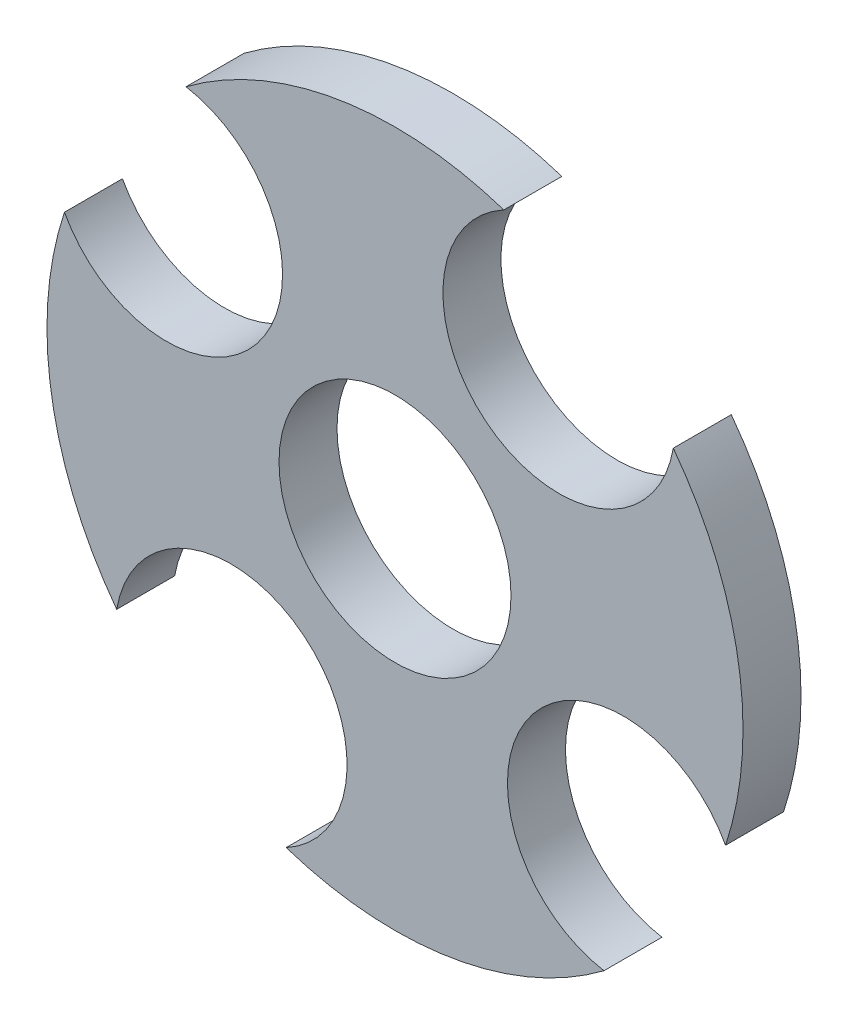
ISO-10303-21;
HEADER;
FILE_DESCRIPTION(('STEP AP214'),'2;1');
FILE_NAME('part.step','',(''),(''),'','','');
FILE_SCHEMA(('AUTOMOTIVE_DESIGN { 1 0 10303 214 1 1 1 1 }'));
ENDSEC;
DATA;
#1=APPLICATION_CONTEXT('core data for automotive mechanical design processes');
#2=APPLICATION_PROTOCOL_DEFINITION('international standard','automotive_design',2000,#1);
#3=PRODUCT_CONTEXT('',#1,'mechanical');
#4=PRODUCT('Part','Part','',(#3));
#5=PRODUCT_RELATED_PRODUCT_CATEGORY('part','',(#4));
#6=PRODUCT_DEFINITION_FORMATION('','',#4);
#7=PRODUCT_DEFINITION_CONTEXT('part definition',#1,'design');
#8=PRODUCT_DEFINITION('design','',#6,#7);
#9=PRODUCT_DEFINITION_SHAPE('','',#8);
#10=(LENGTH_UNIT() NAMED_UNIT(*) SI_UNIT(.MILLI.,.METRE.));
#11=(NAMED_UNIT(*) PLANE_ANGLE_UNIT() SI_UNIT($,.RADIAN.));
#12=(NAMED_UNIT(*) SI_UNIT($,.STERADIAN.) SOLID_ANGLE_UNIT());
#13=UNCERTAINTY_MEASURE_WITH_UNIT(LENGTH_MEASURE(1.E-05),#10,'distance_accuracy_value','');
#14=(GEOMETRIC_REPRESENTATION_CONTEXT(3) GLOBAL_UNCERTAINTY_ASSIGNED_CONTEXT((#13)) GLOBAL_UNIT_ASSIGNED_CONTEXT((#10,
#11,#12)) REPRESENTATION_CONTEXT('',''));
#15=CARTESIAN_POINT('',(0.,0.,0.));
#16=DIRECTION('',(0.,0.,1.));
#17=DIRECTION('',(1.,0.,0.));
#18=AXIS2_PLACEMENT_3D('',#15,#16,#17);
#19=CARTESIAN_POINT('',(-4.48700280832463,-6.25295349859596,3.175));
#20=DIRECTION('',(0.,0.,1.));
#21=DIRECTION('',(1.,0.,0.));
#22=AXIS2_PLACEMENT_3D('',#19,#20,#21);
#23=PLANE('',#22);
#24=CARTESIAN_POINT('',(-8.97400561664927,-12.5059069971919,3.175));
#25=DIRECTION('',(0.,0.,-1.));
#26=DIRECTION('',(1.,0.,0.));
#27=AXIS2_PLACEMENT_3D('',#24,#25,#26);
#28=CIRCLE('',#27,6.35);
#29=CARTESIAN_POINT('',(-15.2336443291926,-11.4384693229321,3.175));
#30=VERTEX_POINT('',#29);
#31=CARTESIAN_POINT('',(-5.95843745398481,-18.0941847870235,3.175));
#32=VERTEX_POINT('',#31);
#33=EDGE_CURVE('E164',#30,#32,#28,.T.);
#34=ORIENTED_EDGE('',*,*,#33,.T.);
#35=CARTESIAN_POINT('',(0.,0.,3.175));
#36=DIRECTION('',(0.,0.,1.));
#37=DIRECTION('',(1.,0.,0.));
#38=AXIS2_PLACEMENT_3D('',#35,#36,#37);
#39=CIRCLE('',#38,19.05);
#40=CARTESIAN_POINT('',(11.4384693229322,-15.2336443291925,3.175));
#41=VERTEX_POINT('',#40);
#42=EDGE_CURVE('E100',#32,#41,#39,.T.);
#43=ORIENTED_EDGE('',*,*,#42,.T.);
#44=CARTESIAN_POINT('',(12.505906997192,-8.97400561664923,3.175));
#45=DIRECTION('',(0.,0.,-1.));
#46=DIRECTION('',(1.,0.,0.));
#47=AXIS2_PLACEMENT_3D('',#44,#45,#46);
#48=CIRCLE('',#47,6.35);
#49=CARTESIAN_POINT('',(18.0941847870235,-5.95843745398474,3.175));
#50=VERTEX_POINT('',#49);
#51=EDGE_CURVE('E185',#41,#50,#48,.T.);
#52=ORIENTED_EDGE('',*,*,#51,.T.);
#53=CARTESIAN_POINT('',(0.,0.,3.175));
#54=DIRECTION('',(0.,0.,1.));
#55=DIRECTION('',(1.,0.,0.));
#56=AXIS2_PLACEMENT_3D('',#53,#54,#55);
#57=CIRCLE('',#56,19.05);
#58=CARTESIAN_POINT('',(15.2336443291926,11.4384693229321,3.175));
#59=VERTEX_POINT('',#58);
#60=EDGE_CURVE('E199',#50,#59,#57,.T.);
#61=ORIENTED_EDGE('',*,*,#60,.T.);
#62=CARTESIAN_POINT('',(8.97400561664927,12.5059069971919,3.175));
#63=DIRECTION('',(0.,0.,-1.));
#64=DIRECTION('',(1.,0.,0.));
#65=AXIS2_PLACEMENT_3D('',#62,#63,#64);
#66=CIRCLE('',#65,6.35);
#67=CARTESIAN_POINT('',(5.9584374539848,18.0941847870235,3.175));
#68=VERTEX_POINT('',#67);
#69=EDGE_CURVE('E119',#59,#68,#66,.T.);
#70=ORIENTED_EDGE('',*,*,#69,.T.);
#71=CARTESIAN_POINT('',(0.,0.,3.175));
#72=DIRECTION('',(0.,0.,1.));
#73=DIRECTION('',(1.,0.,0.));
#74=AXIS2_PLACEMENT_3D('',#71,#72,#73);
#75=CIRCLE('',#74,19.05);
#76=CARTESIAN_POINT('',(-11.4384693229322,15.2336443291925,3.175));
#77=VERTEX_POINT('',#76);
#78=EDGE_CURVE('E113',#68,#77,#75,.T.);
#79=ORIENTED_EDGE('',*,*,#78,.T.);
#80=CARTESIAN_POINT('',(-12.505906997192,8.97400561664922,3.175));
#81=DIRECTION('',(0.,0.,-1.));
#82=DIRECTION('',(1.,0.,0.));
#83=AXIS2_PLACEMENT_3D('',#80,#81,#82);
#84=CIRCLE('',#83,6.35);
#85=CARTESIAN_POINT('',(-18.0941847870235,5.95843745398473,3.175));
#86=VERTEX_POINT('',#85);
#87=EDGE_CURVE('E117',#77,#86,#84,.T.);
#88=ORIENTED_EDGE('',*,*,#87,.T.);
#89=CARTESIAN_POINT('',(0.,0.,3.175));
#90=DIRECTION('',(0.,0.,1.));
#91=DIRECTION('',(1.,0.,0.));
#92=AXIS2_PLACEMENT_3D('',#89,#90,#91);
#93=CIRCLE('',#92,19.05);
#94=EDGE_CURVE('E57',#86,#30,#93,.T.);
#95=ORIENTED_EDGE('',*,*,#94,.T.);
#96=EDGE_LOOP('',(#34,#43,#52,#61,#70,#79,#88,#95));
#97=FACE_BOUND('',#96,.T.);
#98=CARTESIAN_POINT('',(0.,0.,3.175));
#99=DIRECTION('',(0.,0.,1.));
#100=DIRECTION('',(1.,0.,0.));
#101=AXIS2_PLACEMENT_3D('',#98,#99,#100);
#102=CIRCLE('',#101,6.35);
#103=CARTESIAN_POINT('',(6.35,0.,3.175));
#104=VERTEX_POINT('',#103);
#105=EDGE_CURVE('E146',#104,#104,#102,.T.);
#106=ORIENTED_EDGE('',*,*,#105,.F.);
#107=EDGE_LOOP('',(#106));
#108=FACE_BOUND('',#107,.T.);
#109=ADVANCED_FACE('F39',(#97,#108),#23,.T.);
#110=CARTESIAN_POINT('',(-4.48700280832463,-6.25295349859596,0.));
#111=DIRECTION('',(0.,0.,1.));
#112=DIRECTION('',(1.,0.,0.));
#113=AXIS2_PLACEMENT_3D('',#110,#111,#112);
#114=PLANE('',#113);
#115=CARTESIAN_POINT('',(-8.97400561664927,-12.5059069971919,0.));
#116=DIRECTION('',(0.,0.,-1.));
#117=DIRECTION('',(1.,0.,0.));
#118=AXIS2_PLACEMENT_3D('',#115,#116,#117);
#119=CIRCLE('',#118,6.35);
#120=CARTESIAN_POINT('',(-15.2336443291926,-11.4384693229321,0.));
#121=VERTEX_POINT('',#120);
#122=CARTESIAN_POINT('',(-5.95843745398481,-18.0941847870235,0.));
#123=VERTEX_POINT('',#122);
#124=EDGE_CURVE('E141',#121,#123,#119,.T.);
#125=ORIENTED_EDGE('',*,*,#124,.F.);
#126=CARTESIAN_POINT('',(0.,0.,0.));
#127=DIRECTION('',(0.,0.,1.));
#128=DIRECTION('',(1.,0.,0.));
#129=AXIS2_PLACEMENT_3D('',#126,#127,#128);
#130=CIRCLE('',#129,19.05);
#131=CARTESIAN_POINT('',(-18.0941847870235,5.95843745398473,0.));
#132=VERTEX_POINT('',#131);
#133=EDGE_CURVE('E92',#132,#121,#130,.T.);
#134=ORIENTED_EDGE('',*,*,#133,.F.);
#135=CARTESIAN_POINT('',(-12.505906997192,8.97400561664922,0.));
#136=DIRECTION('',(0.,0.,-1.));
#137=DIRECTION('',(1.,0.,0.));
#138=AXIS2_PLACEMENT_3D('',#135,#136,#137);
#139=CIRCLE('',#138,6.35);
#140=CARTESIAN_POINT('',(-11.4384693229322,15.2336443291925,0.));
#141=VERTEX_POINT('',#140);
#142=EDGE_CURVE('E86',#141,#132,#139,.T.);
#143=ORIENTED_EDGE('',*,*,#142,.F.);
#144=CARTESIAN_POINT('',(0.,0.,0.));
#145=DIRECTION('',(0.,0.,1.));
#146=DIRECTION('',(1.,0.,0.));
#147=AXIS2_PLACEMENT_3D('',#144,#145,#146);
#148=CIRCLE('',#147,19.05);
#149=CARTESIAN_POINT('',(5.9584374539848,18.0941847870235,0.));
#150=VERTEX_POINT('',#149);
#151=EDGE_CURVE('E128',#150,#141,#148,.T.);
#152=ORIENTED_EDGE('',*,*,#151,.F.);
#153=CARTESIAN_POINT('',(8.97400561664927,12.5059069971919,0.));
#154=DIRECTION('',(0.,0.,-1.));
#155=DIRECTION('',(1.,0.,0.));
#156=AXIS2_PLACEMENT_3D('',#153,#154,#155);
#157=CIRCLE('',#156,6.35);
#158=CARTESIAN_POINT('',(15.2336443291926,11.4384693229321,0.));
#159=VERTEX_POINT('',#158);
#160=EDGE_CURVE('E155',#159,#150,#157,.T.);
#161=ORIENTED_EDGE('',*,*,#160,.F.);
#162=CARTESIAN_POINT('',(0.,0.,0.));
#163=DIRECTION('',(0.,0.,1.));
#164=DIRECTION('',(1.,0.,0.));
#165=AXIS2_PLACEMENT_3D('',#162,#163,#164);
#166=CIRCLE('',#165,19.05);
#167=CARTESIAN_POINT('',(18.0941847870235,-5.95843745398474,0.));
#168=VERTEX_POINT('',#167);
#169=EDGE_CURVE('E152',#168,#159,#166,.T.);
#170=ORIENTED_EDGE('',*,*,#169,.F.);
#171=CARTESIAN_POINT('',(12.505906997192,-8.97400561664923,0.));
#172=DIRECTION('',(0.,0.,-1.));
#173=DIRECTION('',(1.,0.,0.));
#174=AXIS2_PLACEMENT_3D('',#171,#172,#173);
#175=CIRCLE('',#174,6.35);
#176=CARTESIAN_POINT('',(11.4384693229322,-15.2336443291925,0.));
#177=VERTEX_POINT('',#176);
#178=EDGE_CURVE('E149',#177,#168,#175,.T.);
#179=ORIENTED_EDGE('',*,*,#178,.F.);
#180=CARTESIAN_POINT('',(0.,0.,0.));
#181=DIRECTION('',(0.,0.,1.));
#182=DIRECTION('',(1.,0.,0.));
#183=AXIS2_PLACEMENT_3D('',#180,#181,#182);
#184=CIRCLE('',#183,19.05);
#185=EDGE_CURVE('E145',#123,#177,#184,.T.);
#186=ORIENTED_EDGE('',*,*,#185,.F.);
#187=EDGE_LOOP('',(#125,#134,#143,#152,#161,#170,#179,#186));
#188=FACE_BOUND('',#187,.T.);
#189=CARTESIAN_POINT('',(0.,0.,0.));
#190=DIRECTION('',(0.,0.,1.));
#191=DIRECTION('',(1.,0.,0.));
#192=AXIS2_PLACEMENT_3D('',#189,#190,#191);
#193=CIRCLE('',#192,6.35);
#194=CARTESIAN_POINT('',(6.35,0.,0.));
#195=VERTEX_POINT('',#194);
#196=EDGE_CURVE('E209',#195,#195,#193,.T.);
#197=ORIENTED_EDGE('',*,*,#196,.T.);
#198=EDGE_LOOP('',(#197));
#199=FACE_BOUND('',#198,.T.);
#200=ADVANCED_FACE('F189',(#188,#199),#114,.F.);
#201=CARTESIAN_POINT('',(-8.97400561664927,-12.5059069971919,3.175));
#202=DIRECTION('',(0.,0.,-1.));
#203=DIRECTION('',(-1.,0.,0.));
#204=AXIS2_PLACEMENT_3D('',#201,#202,#203);
#205=CYLINDRICAL_SURFACE('',#204,6.35);
#206=ORIENTED_EDGE('',*,*,#124,.T.);
#207=DIRECTION('',(0.,0.,-1.));
#208=VECTOR('',#207,1.);
#209=CARTESIAN_POINT('',(-5.95843745398481,-18.0941847870235,3.175));
#210=LINE('',#209,#208);
#211=EDGE_CURVE('E11',#32,#123,#210,.T.);
#212=ORIENTED_EDGE('',*,*,#211,.F.);
#213=ORIENTED_EDGE('',*,*,#33,.F.);
#214=DIRECTION('',(0.,0.,-1.));
#215=VECTOR('',#214,1.);
#216=CARTESIAN_POINT('',(-15.2336443291926,-11.4384693229321,3.175));
#217=LINE('',#216,#215);
#218=EDGE_CURVE('E137',#30,#121,#217,.T.);
#219=ORIENTED_EDGE('',*,*,#218,.T.);
#220=EDGE_LOOP('',(#206,#212,#213,#219));
#221=FACE_BOUND('',#220,.T.);
#222=ADVANCED_FACE('F41',(#221),#205,.F.);
#223=CARTESIAN_POINT('',(0.,0.,3.175));
#224=DIRECTION('',(0.,0.,-1.));
#225=DIRECTION('',(-1.,0.,0.));
#226=AXIS2_PLACEMENT_3D('',#223,#224,#225);
#227=CYLINDRICAL_SURFACE('',#226,19.05);
#228=ORIENTED_EDGE('',*,*,#185,.T.);
#229=DIRECTION('',(0.,0.,-1.));
#230=VECTOR('',#229,1.);
#231=CARTESIAN_POINT('',(11.4384693229322,-15.2336443291925,3.175));
#232=LINE('',#231,#230);
#233=EDGE_CURVE('E49',#41,#177,#232,.T.);
#234=ORIENTED_EDGE('',*,*,#233,.F.);
#235=ORIENTED_EDGE('',*,*,#42,.F.);
#236=ORIENTED_EDGE('',*,*,#211,.T.);
#237=EDGE_LOOP('',(#228,#234,#235,#236));
#238=FACE_BOUND('',#237,.T.);
#239=ADVANCED_FACE('F239',(#238),#227,.T.);
#240=CARTESIAN_POINT('',(12.505906997192,-8.97400561664923,3.175));
#241=DIRECTION('',(0.,0.,-1.));
#242=DIRECTION('',(-1.,0.,0.));
#243=AXIS2_PLACEMENT_3D('',#240,#241,#242);
#244=CYLINDRICAL_SURFACE('',#243,6.35);
#245=ORIENTED_EDGE('',*,*,#178,.T.);
#246=DIRECTION('',(0.,0.,-1.));
#247=VECTOR('',#246,1.);
#248=CARTESIAN_POINT('',(18.0941847870235,-5.95843745398474,3.175));
#249=LINE('',#248,#247);
#250=EDGE_CURVE('E175',#50,#168,#249,.T.);
#251=ORIENTED_EDGE('',*,*,#250,.F.);
#252=ORIENTED_EDGE('',*,*,#51,.F.);
#253=ORIENTED_EDGE('',*,*,#233,.T.);
#254=EDGE_LOOP('',(#245,#251,#252,#253));
#255=FACE_BOUND('',#254,.T.);
#256=ADVANCED_FACE('F183',(#255),#244,.F.);
#257=CARTESIAN_POINT('',(0.,0.,3.175));
#258=DIRECTION('',(0.,0.,-1.));
#259=DIRECTION('',(-1.,0.,0.));
#260=AXIS2_PLACEMENT_3D('',#257,#258,#259);
#261=CYLINDRICAL_SURFACE('',#260,19.05);
#262=ORIENTED_EDGE('',*,*,#169,.T.);
#263=DIRECTION('',(0.,0.,-1.));
#264=VECTOR('',#263,1.);
#265=CARTESIAN_POINT('',(15.2336443291926,11.4384693229321,3.175));
#266=LINE('',#265,#264);
#267=EDGE_CURVE('E171',#59,#159,#266,.T.);
#268=ORIENTED_EDGE('',*,*,#267,.F.);
#269=ORIENTED_EDGE('',*,*,#60,.F.);
#270=ORIENTED_EDGE('',*,*,#250,.T.);
#271=EDGE_LOOP('',(#262,#268,#269,#270));
#272=FACE_BOUND('',#271,.T.);
#273=ADVANCED_FACE('F194',(#272),#261,.T.);
#274=CARTESIAN_POINT('',(8.97400561664927,12.5059069971919,3.175));
#275=DIRECTION('',(0.,0.,-1.));
#276=DIRECTION('',(-1.,0.,0.));
#277=AXIS2_PLACEMENT_3D('',#274,#275,#276);
#278=CYLINDRICAL_SURFACE('',#277,6.35);
#279=ORIENTED_EDGE('',*,*,#160,.T.);
#280=DIRECTION('',(0.,0.,-1.));
#281=VECTOR('',#280,1.);
#282=CARTESIAN_POINT('',(5.9584374539848,18.0941847870235,3.175));
#283=LINE('',#282,#281);
#284=EDGE_CURVE('E130',#68,#150,#283,.T.);
#285=ORIENTED_EDGE('',*,*,#284,.F.);
#286=ORIENTED_EDGE('',*,*,#69,.F.);
#287=ORIENTED_EDGE('',*,*,#267,.T.);
#288=EDGE_LOOP('',(#279,#285,#286,#287));
#289=FACE_BOUND('',#288,.T.);
#290=ADVANCED_FACE('F197',(#289),#278,.F.);
#291=CARTESIAN_POINT('',(0.,0.,3.175));
#292=DIRECTION('',(0.,0.,-1.));
#293=DIRECTION('',(-1.,0.,0.));
#294=AXIS2_PLACEMENT_3D('',#291,#292,#293);
#295=CYLINDRICAL_SURFACE('',#294,19.05);
#296=ORIENTED_EDGE('',*,*,#151,.T.);
#297=DIRECTION('',(0.,0.,-1.));
#298=VECTOR('',#297,1.);
#299=CARTESIAN_POINT('',(-11.4384693229322,15.2336443291925,3.175));
#300=LINE('',#299,#298);
#301=EDGE_CURVE('E125',#77,#141,#300,.T.);
#302=ORIENTED_EDGE('',*,*,#301,.F.);
#303=ORIENTED_EDGE('',*,*,#78,.F.);
#304=ORIENTED_EDGE('',*,*,#284,.T.);
#305=EDGE_LOOP('',(#296,#302,#303,#304));
#306=FACE_BOUND('',#305,.T.);
#307=ADVANCED_FACE('F126',(#306),#295,.T.);
#308=CARTESIAN_POINT('',(-12.505906997192,8.97400561664922,3.175));
#309=DIRECTION('',(0.,0.,-1.));
#310=DIRECTION('',(-1.,0.,0.));
#311=AXIS2_PLACEMENT_3D('',#308,#309,#310);
#312=CYLINDRICAL_SURFACE('',#311,6.35);
#313=ORIENTED_EDGE('',*,*,#142,.T.);
#314=DIRECTION('',(0.,0.,-1.));
#315=VECTOR('',#314,1.);
#316=CARTESIAN_POINT('',(-18.0941847870235,5.95843745398473,3.175));
#317=LINE('',#316,#315);
#318=EDGE_CURVE('E131',#86,#132,#317,.T.);
#319=ORIENTED_EDGE('',*,*,#318,.F.);
#320=ORIENTED_EDGE('',*,*,#87,.F.);
#321=ORIENTED_EDGE('',*,*,#301,.T.);
#322=EDGE_LOOP('',(#313,#319,#320,#321));
#323=FACE_BOUND('',#322,.T.);
#324=ADVANCED_FACE('F133',(#323),#312,.F.);
#325=CARTESIAN_POINT('',(0.,0.,3.175));
#326=DIRECTION('',(0.,0.,-1.));
#327=DIRECTION('',(-1.,0.,0.));
#328=AXIS2_PLACEMENT_3D('',#325,#326,#327);
#329=CYLINDRICAL_SURFACE('',#328,19.05);
#330=ORIENTED_EDGE('',*,*,#133,.T.);
#331=ORIENTED_EDGE('',*,*,#218,.F.);
#332=ORIENTED_EDGE('',*,*,#94,.F.);
#333=ORIENTED_EDGE('',*,*,#318,.T.);
#334=EDGE_LOOP('',(#330,#331,#332,#333));
#335=FACE_BOUND('',#334,.T.);
#336=ADVANCED_FACE('F227',(#335),#329,.T.);
#337=CARTESIAN_POINT('',(0.,0.,3.175));
#338=DIRECTION('',(0.,0.,-1.));
#339=DIRECTION('',(-1.,0.,0.));
#340=AXIS2_PLACEMENT_3D('',#337,#338,#339);
#341=CYLINDRICAL_SURFACE('',#340,6.35);
#342=ORIENTED_EDGE('',*,*,#105,.T.);
#343=EDGE_LOOP('',(#342));
#344=FACE_BOUND('',#343,.T.);
#345=ORIENTED_EDGE('',*,*,#196,.F.);
#346=EDGE_LOOP('',(#345));
#347=FACE_BOUND('',#346,.T.);
#348=ADVANCED_FACE('F217',(#344,#347),#341,.F.);
#349=CLOSED_SHELL('',(#109,#200,#222,#239,#256,#273,#290,#307,#324,#336,#348));
#350=MANIFOLD_SOLID_BREP('B2',#349);
#351=ADVANCED_BREP_SHAPE_REPRESENTATION('',(#18,#350),#14);
#352=SHAPE_DEFINITION_REPRESENTATION(#9,#351);
ENDSEC;
END-ISO-10303-21;
